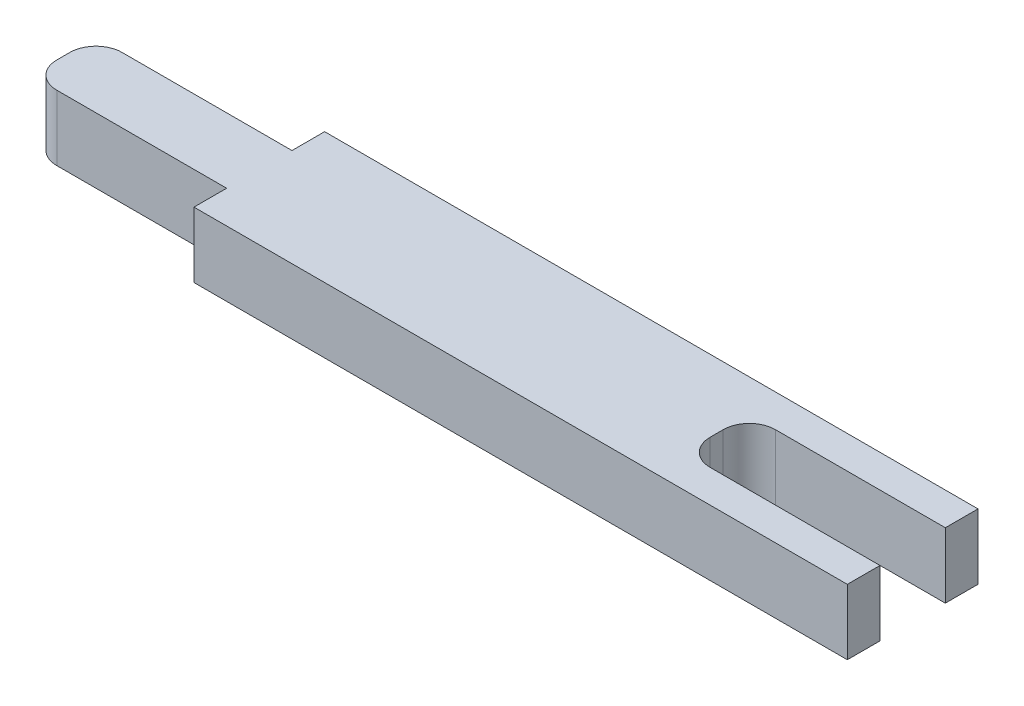
ISO-10303-21;
HEADER;
FILE_DESCRIPTION(('STEP AP214'),'2;1');
FILE_NAME('part.step','',(''),(''),'','','');
FILE_SCHEMA(('AUTOMOTIVE_DESIGN { 1 0 10303 214 1 1 1 1 }'));
ENDSEC;
DATA;
#1=APPLICATION_CONTEXT('core data for automotive mechanical design processes');
#2=APPLICATION_PROTOCOL_DEFINITION('international standard','automotive_design',2000,#1);
#3=PRODUCT_CONTEXT('',#1,'mechanical');
#4=PRODUCT('Part','Part','',(#3));
#5=PRODUCT_RELATED_PRODUCT_CATEGORY('part','',(#4));
#6=PRODUCT_DEFINITION_FORMATION('','',#4);
#7=PRODUCT_DEFINITION_CONTEXT('part definition',#1,'design');
#8=PRODUCT_DEFINITION('design','',#6,#7);
#9=PRODUCT_DEFINITION_SHAPE('','',#8);
#10=(LENGTH_UNIT() NAMED_UNIT(*) SI_UNIT(.MILLI.,.METRE.));
#11=(NAMED_UNIT(*) PLANE_ANGLE_UNIT() SI_UNIT($,.RADIAN.));
#12=(NAMED_UNIT(*) SI_UNIT($,.STERADIAN.) SOLID_ANGLE_UNIT());
#13=UNCERTAINTY_MEASURE_WITH_UNIT(LENGTH_MEASURE(1.E-05),#10,'distance_accuracy_value','');
#14=(GEOMETRIC_REPRESENTATION_CONTEXT(3) GLOBAL_UNCERTAINTY_ASSIGNED_CONTEXT((#13)) GLOBAL_UNIT_ASSIGNED_CONTEXT((#10,
#11,#12)) REPRESENTATION_CONTEXT('',''));
#15=CARTESIAN_POINT('',(0.,0.,0.));
#16=DIRECTION('',(0.,0.,1.));
#17=DIRECTION('',(1.,0.,0.));
#18=AXIS2_PLACEMENT_3D('',#15,#16,#17);
#19=CARTESIAN_POINT('',(0.,2.5,0.));
#20=DIRECTION('',(1.,0.,0.));
#21=DIRECTION('',(0.,0.,-1.));
#22=AXIS2_PLACEMENT_3D('',#19,#20,#21);
#23=PLANE('',#22);
#24=DIRECTION('',(0.,1.,0.));
#25=VECTOR('',#24,1.);
#26=CARTESIAN_POINT('',(0.,-2.5,-2.5));
#27=LINE('',#26,#25);
#28=CARTESIAN_POINT('',(0.,-2.5,-2.5));
#29=VERTEX_POINT('',#28);
#30=CARTESIAN_POINT('',(0.,2.5,-2.5));
#31=VERTEX_POINT('',#30);
#32=EDGE_CURVE('E243',#29,#31,#27,.T.);
#33=ORIENTED_EDGE('',*,*,#32,.F.);
#34=DIRECTION('',(0.,0.,1.));
#35=VECTOR('',#34,1.);
#36=CARTESIAN_POINT('',(0.,-2.5,0.));
#37=LINE('',#36,#35);
#38=CARTESIAN_POINT('',(0.,-2.5,0.));
#39=VERTEX_POINT('',#38);
#40=EDGE_CURVE('E187',#29,#39,#37,.T.);
#41=ORIENTED_EDGE('',*,*,#40,.T.);
#42=DIRECTION('',(0.,-1.,0.));
#43=VECTOR('',#42,1.);
#44=CARTESIAN_POINT('',(0.,2.5,0.));
#45=LINE('',#44,#43);
#46=CARTESIAN_POINT('',(0.,2.5,0.));
#47=VERTEX_POINT('',#46);
#48=EDGE_CURVE('E11',#47,#39,#45,.T.);
#49=ORIENTED_EDGE('',*,*,#48,.F.);
#50=DIRECTION('',(0.,0.,1.));
#51=VECTOR('',#50,1.);
#52=CARTESIAN_POINT('',(0.,2.5,0.));
#53=LINE('',#52,#51);
#54=EDGE_CURVE('E204',#31,#47,#53,.T.);
#55=ORIENTED_EDGE('',*,*,#54,.F.);
#56=EDGE_LOOP('',(#33,#41,#49,#55));
#57=FACE_BOUND('',#56,.T.);
#58=ADVANCED_FACE('F44',(#57),#23,.F.);
#59=CARTESIAN_POINT('',(50.,2.5,0.));
#60=DIRECTION('',(-1.,0.,0.));
#61=DIRECTION('',(0.,0.,1.));
#62=AXIS2_PLACEMENT_3D('',#59,#60,#61);
#63=PLANE('',#62);
#64=DIRECTION('',(0.,1.,0.));
#65=VECTOR('',#64,1.);
#66=CARTESIAN_POINT('',(50.,-2.5,-7.5));
#67=LINE('',#66,#65);
#68=CARTESIAN_POINT('',(50.,-2.5,-7.5));
#69=VERTEX_POINT('',#68);
#70=CARTESIAN_POINT('',(50.,2.5,-7.5));
#71=VERTEX_POINT('',#70);
#72=EDGE_CURVE('E228',#69,#71,#67,.T.);
#73=ORIENTED_EDGE('',*,*,#72,.F.);
#74=DIRECTION('',(0.,0.,-1.));
#75=VECTOR('',#74,1.);
#76=CARTESIAN_POINT('',(50.,-2.5,0.));
#77=LINE('',#76,#75);
#78=CARTESIAN_POINT('',(50.,-2.5,-10.));
#79=VERTEX_POINT('',#78);
#80=EDGE_CURVE('E188',#69,#79,#77,.T.);
#81=ORIENTED_EDGE('',*,*,#80,.T.);
#82=DIRECTION('',(0.,-1.,0.));
#83=VECTOR('',#82,1.);
#84=CARTESIAN_POINT('',(50.,2.5,-10.));
#85=LINE('',#84,#83);
#86=CARTESIAN_POINT('',(50.,2.5,-10.));
#87=VERTEX_POINT('',#86);
#88=EDGE_CURVE('E210',#87,#79,#85,.T.);
#89=ORIENTED_EDGE('',*,*,#88,.F.);
#90=DIRECTION('',(0.,0.,-1.));
#91=VECTOR('',#90,1.);
#92=CARTESIAN_POINT('',(50.,2.5,0.));
#93=LINE('',#92,#91);
#94=EDGE_CURVE('E276',#71,#87,#93,.T.);
#95=ORIENTED_EDGE('',*,*,#94,.F.);
#96=EDGE_LOOP('',(#73,#81,#89,#95));
#97=FACE_BOUND('',#96,.T.);
#98=ADVANCED_FACE('F291',(#97),#63,.F.);
#99=CARTESIAN_POINT('',(0.,2.5,0.));
#100=DIRECTION('',(0.,-1.,0.));
#101=DIRECTION('',(0.,0.,-1.));
#102=AXIS2_PLACEMENT_3D('',#99,#100,#101);
#103=PLANE('',#102);
#104=DIRECTION('',(-1.,0.,0.));
#105=VECTOR('',#104,1.);
#106=CARTESIAN_POINT('',(50.,2.5,-7.5));
#107=LINE('',#106,#105);
#108=CARTESIAN_POINT('',(37.,2.5,-7.5));
#109=VERTEX_POINT('',#108);
#110=EDGE_CURVE('E238',#71,#109,#107,.T.);
#111=ORIENTED_EDGE('',*,*,#110,.F.);
#112=ORIENTED_EDGE('',*,*,#94,.T.);
#113=DIRECTION('',(-1.,0.,0.));
#114=VECTOR('',#113,1.);
#115=CARTESIAN_POINT('',(0.,2.5,-10.));
#116=LINE('',#115,#114);
#117=CARTESIAN_POINT('',(0.,2.5,-10.));
#118=VERTEX_POINT('',#117);
#119=EDGE_CURVE('E191',#87,#118,#116,.T.);
#120=ORIENTED_EDGE('',*,*,#119,.T.);
#121=CARTESIAN_POINT('',(0.,2.5,-7.5));
#122=VERTEX_POINT('',#121);
#123=EDGE_CURVE('E273',#118,#122,#53,.T.);
#124=ORIENTED_EDGE('',*,*,#123,.T.);
#125=DIRECTION('',(-1.,0.,0.));
#126=VECTOR('',#125,1.);
#127=CARTESIAN_POINT('',(0.,2.5,-7.5));
#128=LINE('',#127,#126);
#129=CARTESIAN_POINT('',(-13.,2.5,-7.5));
#130=VERTEX_POINT('',#129);
#131=EDGE_CURVE('E62',#122,#130,#128,.T.);
#132=ORIENTED_EDGE('',*,*,#131,.T.);
#133=CARTESIAN_POINT('',(-13.,2.5,-5.5));
#134=DIRECTION('',(0.,1.,0.));
#135=DIRECTION('',(0.,0.,1.));
#136=AXIS2_PLACEMENT_3D('',#133,#134,#135);
#137=CIRCLE('',#136,2.);
#138=CARTESIAN_POINT('',(-15.,2.5,-5.49999999999998));
#139=VERTEX_POINT('',#138);
#140=EDGE_CURVE('E298',#130,#139,#137,.T.);
#141=ORIENTED_EDGE('',*,*,#140,.T.);
#142=DIRECTION('',(0.,0.,1.));
#143=VECTOR('',#142,1.);
#144=CARTESIAN_POINT('',(-15.,2.5,-4.50000000000001));
#145=LINE('',#144,#143);
#146=CARTESIAN_POINT('',(-15.,2.5,-4.50000000000001));
#147=VERTEX_POINT('',#146);
#148=EDGE_CURVE('E301',#139,#147,#145,.T.);
#149=ORIENTED_EDGE('',*,*,#148,.T.);
#150=CARTESIAN_POINT('',(-13.,2.5,-4.5));
#151=DIRECTION('',(0.,1.,0.));
#152=DIRECTION('',(0.,0.,-1.));
#153=AXIS2_PLACEMENT_3D('',#150,#151,#152);
#154=CIRCLE('',#153,2.);
#155=CARTESIAN_POINT('',(-13.,2.5,-2.5));
#156=VERTEX_POINT('',#155);
#157=EDGE_CURVE('E313',#147,#156,#154,.T.);
#158=ORIENTED_EDGE('',*,*,#157,.T.);
#159=DIRECTION('',(1.,0.,0.));
#160=VECTOR('',#159,1.);
#161=CARTESIAN_POINT('',(0.,2.5,-2.5));
#162=LINE('',#161,#160);
#163=EDGE_CURVE('E176',#156,#31,#162,.T.);
#164=ORIENTED_EDGE('',*,*,#163,.T.);
#165=ORIENTED_EDGE('',*,*,#54,.T.);
#166=DIRECTION('',(1.,0.,0.));
#167=VECTOR('',#166,1.);
#168=CARTESIAN_POINT('',(0.,2.5,0.));
#169=LINE('',#168,#167);
#170=CARTESIAN_POINT('',(50.,2.5,0.));
#171=VERTEX_POINT('',#170);
#172=EDGE_CURVE('E280',#47,#171,#169,.T.);
#173=ORIENTED_EDGE('',*,*,#172,.T.);
#174=CARTESIAN_POINT('',(50.,2.5,-2.5));
#175=VERTEX_POINT('',#174);
#176=EDGE_CURVE('E218',#171,#175,#93,.T.);
#177=ORIENTED_EDGE('',*,*,#176,.T.);
#178=DIRECTION('',(1.,0.,0.));
#179=VECTOR('',#178,1.);
#180=CARTESIAN_POINT('',(50.,2.5,-2.5));
#181=LINE('',#180,#179);
#182=CARTESIAN_POINT('',(37.,2.5,-2.5));
#183=VERTEX_POINT('',#182);
#184=EDGE_CURVE('E260',#183,#175,#181,.T.);
#185=ORIENTED_EDGE('',*,*,#184,.F.);
#186=CARTESIAN_POINT('',(37.,2.5,-4.5));
#187=DIRECTION('',(0.,1.,0.));
#188=DIRECTION('',(0.,0.,-1.));
#189=AXIS2_PLACEMENT_3D('',#186,#187,#188);
#190=CIRCLE('',#189,2.);
#191=CARTESIAN_POINT('',(35.,2.5,-4.50000000000002));
#192=VERTEX_POINT('',#191);
#193=EDGE_CURVE('E251',#192,#183,#190,.T.);
#194=ORIENTED_EDGE('',*,*,#193,.F.);
#195=DIRECTION('',(0.,0.,1.));
#196=VECTOR('',#195,1.);
#197=CARTESIAN_POINT('',(35.,2.5,-5.49999999999998));
#198=LINE('',#197,#196);
#199=CARTESIAN_POINT('',(35.,2.5,-5.49999999999998));
#200=VERTEX_POINT('',#199);
#201=EDGE_CURVE('E246',#200,#192,#198,.T.);
#202=ORIENTED_EDGE('',*,*,#201,.F.);
#203=CARTESIAN_POINT('',(37.,2.5,-5.5));
#204=DIRECTION('',(0.,1.,0.));
#205=DIRECTION('',(0.,0.,1.));
#206=AXIS2_PLACEMENT_3D('',#203,#204,#205);
#207=CIRCLE('',#206,2.);
#208=EDGE_CURVE('E241',#109,#200,#207,.T.);
#209=ORIENTED_EDGE('',*,*,#208,.F.);
#210=EDGE_LOOP('',(#111,#112,#120,#124,#132,#141,#149,#158,#164,#165,#173,#177,#185,#194,#202,#209));
#211=FACE_BOUND('',#210,.T.);
#212=ADVANCED_FACE('F289',(#211),#103,.F.);
#213=CARTESIAN_POINT('',(0.,-2.5,0.));
#214=DIRECTION('',(0.,-1.,0.));
#215=DIRECTION('',(0.,0.,-1.));
#216=AXIS2_PLACEMENT_3D('',#213,#214,#215);
#217=PLANE('',#216);
#218=CARTESIAN_POINT('',(37.,-2.5,-4.5));
#219=DIRECTION('',(0.,1.,0.));
#220=DIRECTION('',(0.,0.,-1.));
#221=AXIS2_PLACEMENT_3D('',#218,#219,#220);
#222=CIRCLE('',#221,2.);
#223=CARTESIAN_POINT('',(35.,-2.5,-4.50000000000002));
#224=VERTEX_POINT('',#223);
#225=CARTESIAN_POINT('',(37.,-2.5,-2.5));
#226=VERTEX_POINT('',#225);
#227=EDGE_CURVE('E66',#224,#226,#222,.T.);
#228=ORIENTED_EDGE('',*,*,#227,.T.);
#229=DIRECTION('',(1.,0.,0.));
#230=VECTOR('',#229,1.);
#231=CARTESIAN_POINT('',(50.,-2.5,-2.5));
#232=LINE('',#231,#230);
#233=CARTESIAN_POINT('',(50.,-2.5,-2.5));
#234=VERTEX_POINT('',#233);
#235=EDGE_CURVE('E227',#226,#234,#232,.T.);
#236=ORIENTED_EDGE('',*,*,#235,.T.);
#237=CARTESIAN_POINT('',(50.,-2.5,0.));
#238=VERTEX_POINT('',#237);
#239=EDGE_CURVE('E197',#238,#234,#77,.T.);
#240=ORIENTED_EDGE('',*,*,#239,.F.);
#241=DIRECTION('',(1.,0.,0.));
#242=VECTOR('',#241,1.);
#243=CARTESIAN_POINT('',(0.,-2.5,0.));
#244=LINE('',#243,#242);
#245=EDGE_CURVE('E183',#39,#238,#244,.T.);
#246=ORIENTED_EDGE('',*,*,#245,.F.);
#247=ORIENTED_EDGE('',*,*,#40,.F.);
#248=DIRECTION('',(1.,0.,0.));
#249=VECTOR('',#248,1.);
#250=CARTESIAN_POINT('',(0.,-2.5,-2.5));
#251=LINE('',#250,#249);
#252=CARTESIAN_POINT('',(-13.,-2.5,-2.5));
#253=VERTEX_POINT('',#252);
#254=EDGE_CURVE('E170',#253,#29,#251,.T.);
#255=ORIENTED_EDGE('',*,*,#254,.F.);
#256=CARTESIAN_POINT('',(-13.,-2.5,-4.5));
#257=DIRECTION('',(0.,1.,0.));
#258=DIRECTION('',(0.,0.,-1.));
#259=AXIS2_PLACEMENT_3D('',#256,#257,#258);
#260=CIRCLE('',#259,2.);
#261=CARTESIAN_POINT('',(-15.,-2.5,-4.50000000000001));
#262=VERTEX_POINT('',#261);
#263=EDGE_CURVE('E472',#262,#253,#260,.T.);
#264=ORIENTED_EDGE('',*,*,#263,.F.);
#265=DIRECTION('',(0.,0.,1.));
#266=VECTOR('',#265,1.);
#267=CARTESIAN_POINT('',(-15.,-2.5,-4.50000000000001));
#268=LINE('',#267,#266);
#269=CARTESIAN_POINT('',(-15.,-2.5,-5.49999999999998));
#270=VERTEX_POINT('',#269);
#271=EDGE_CURVE('E480',#270,#262,#268,.T.);
#272=ORIENTED_EDGE('',*,*,#271,.F.);
#273=CARTESIAN_POINT('',(-13.,-2.5,-5.5));
#274=DIRECTION('',(0.,1.,0.));
#275=DIRECTION('',(0.,0.,1.));
#276=AXIS2_PLACEMENT_3D('',#273,#274,#275);
#277=CIRCLE('',#276,2.);
#278=CARTESIAN_POINT('',(-13.,-2.5,-7.5));
#279=VERTEX_POINT('',#278);
#280=EDGE_CURVE('E180',#279,#270,#277,.T.);
#281=ORIENTED_EDGE('',*,*,#280,.F.);
#282=DIRECTION('',(-1.,0.,0.));
#283=VECTOR('',#282,1.);
#284=CARTESIAN_POINT('',(0.,-2.5,-7.5));
#285=LINE('',#284,#283);
#286=CARTESIAN_POINT('',(0.,-2.5,-7.5));
#287=VERTEX_POINT('',#286);
#288=EDGE_CURVE('E159',#287,#279,#285,.T.);
#289=ORIENTED_EDGE('',*,*,#288,.F.);
#290=CARTESIAN_POINT('',(0.,-2.5,-10.));
#291=VERTEX_POINT('',#290);
#292=EDGE_CURVE('E171',#291,#287,#37,.T.);
#293=ORIENTED_EDGE('',*,*,#292,.F.);
#294=DIRECTION('',(-1.,0.,0.));
#295=VECTOR('',#294,1.);
#296=CARTESIAN_POINT('',(0.,-2.5,-10.));
#297=LINE('',#296,#295);
#298=EDGE_CURVE('E203',#79,#291,#297,.T.);
#299=ORIENTED_EDGE('',*,*,#298,.F.);
#300=ORIENTED_EDGE('',*,*,#80,.F.);
#301=DIRECTION('',(-1.,0.,0.));
#302=VECTOR('',#301,1.);
#303=CARTESIAN_POINT('',(50.,-2.5,-7.5));
#304=LINE('',#303,#302);
#305=CARTESIAN_POINT('',(37.,-2.5,-7.5));
#306=VERTEX_POINT('',#305);
#307=EDGE_CURVE('E257',#69,#306,#304,.T.);
#308=ORIENTED_EDGE('',*,*,#307,.T.);
#309=CARTESIAN_POINT('',(37.,-2.5,-5.5));
#310=DIRECTION('',(0.,1.,0.));
#311=DIRECTION('',(0.,0.,1.));
#312=AXIS2_PLACEMENT_3D('',#309,#310,#311);
#313=CIRCLE('',#312,2.);
#314=CARTESIAN_POINT('',(35.,-2.5,-5.49999999999998));
#315=VERTEX_POINT('',#314);
#316=EDGE_CURVE('E331',#306,#315,#313,.T.);
#317=ORIENTED_EDGE('',*,*,#316,.T.);
#318=DIRECTION('',(0.,0.,1.));
#319=VECTOR('',#318,1.);
#320=CARTESIAN_POINT('',(35.,-2.5,-5.49999999999998));
#321=LINE('',#320,#319);
#322=EDGE_CURVE('E237',#315,#224,#321,.T.);
#323=ORIENTED_EDGE('',*,*,#322,.T.);
#324=EDGE_LOOP('',(#228,#236,#240,#246,#247,#255,#264,#272,#281,#289,#293,#299,#300,#308,#317,#323));
#325=FACE_BOUND('',#324,.T.);
#326=ADVANCED_FACE('F175',(#325),#217,.T.);
#327=ORIENTED_EDGE('',*,*,#292,.T.);
#328=DIRECTION('',(0.,1.,0.));
#329=VECTOR('',#328,1.);
#330=CARTESIAN_POINT('',(0.,-2.5,-7.5));
#331=LINE('',#330,#329);
#332=EDGE_CURVE('E160',#287,#122,#331,.T.);
#333=ORIENTED_EDGE('',*,*,#332,.T.);
#334=ORIENTED_EDGE('',*,*,#123,.F.);
#335=DIRECTION('',(0.,-1.,0.));
#336=VECTOR('',#335,1.);
#337=CARTESIAN_POINT('',(0.,2.5,-10.));
#338=LINE('',#337,#336);
#339=EDGE_CURVE('E181',#118,#291,#338,.T.);
#340=ORIENTED_EDGE('',*,*,#339,.T.);
#341=EDGE_LOOP('',(#327,#333,#334,#340));
#342=FACE_BOUND('',#341,.T.);
#343=ADVANCED_FACE('F50',(#342),#23,.F.);
#344=CARTESIAN_POINT('',(0.,2.5,0.));
#345=DIRECTION('',(0.,0.,-1.));
#346=DIRECTION('',(-1.,0.,0.));
#347=AXIS2_PLACEMENT_3D('',#344,#345,#346);
#348=PLANE('',#347);
#349=ORIENTED_EDGE('',*,*,#245,.T.);
#350=DIRECTION('',(0.,-1.,0.));
#351=VECTOR('',#350,1.);
#352=CARTESIAN_POINT('',(50.,2.5,0.));
#353=LINE('',#352,#351);
#354=EDGE_CURVE('E53',#171,#238,#353,.T.);
#355=ORIENTED_EDGE('',*,*,#354,.F.);
#356=ORIENTED_EDGE('',*,*,#172,.F.);
#357=ORIENTED_EDGE('',*,*,#48,.T.);
#358=EDGE_LOOP('',(#349,#355,#356,#357));
#359=FACE_BOUND('',#358,.T.);
#360=ADVANCED_FACE('F368',(#359),#348,.F.);
#361=ORIENTED_EDGE('',*,*,#239,.T.);
#362=DIRECTION('',(0.,1.,0.));
#363=VECTOR('',#362,1.);
#364=CARTESIAN_POINT('',(50.,-2.5,-2.5));
#365=LINE('',#364,#363);
#366=EDGE_CURVE('E195',#234,#175,#365,.T.);
#367=ORIENTED_EDGE('',*,*,#366,.T.);
#368=ORIENTED_EDGE('',*,*,#176,.F.);
#369=ORIENTED_EDGE('',*,*,#354,.T.);
#370=EDGE_LOOP('',(#361,#367,#368,#369));
#371=FACE_BOUND('',#370,.T.);
#372=ADVANCED_FACE('F216',(#371),#63,.F.);
#373=CARTESIAN_POINT('',(0.,2.5,-10.));
#374=DIRECTION('',(0.,0.,1.));
#375=DIRECTION('',(1.,0.,0.));
#376=AXIS2_PLACEMENT_3D('',#373,#374,#375);
#377=PLANE('',#376);
#378=ORIENTED_EDGE('',*,*,#298,.T.);
#379=ORIENTED_EDGE('',*,*,#339,.F.);
#380=ORIENTED_EDGE('',*,*,#119,.F.);
#381=ORIENTED_EDGE('',*,*,#88,.T.);
#382=EDGE_LOOP('',(#378,#379,#380,#381));
#383=FACE_BOUND('',#382,.T.);
#384=ADVANCED_FACE('F297',(#383),#377,.F.);
#385=CARTESIAN_POINT('',(50.,-2.5,-2.5));
#386=DIRECTION('',(0.,0.,1.));
#387=DIRECTION('',(1.,0.,0.));
#388=AXIS2_PLACEMENT_3D('',#385,#386,#387);
#389=PLANE('',#388);
#390=ORIENTED_EDGE('',*,*,#184,.T.);
#391=ORIENTED_EDGE('',*,*,#366,.F.);
#392=ORIENTED_EDGE('',*,*,#235,.F.);
#393=DIRECTION('',(0.,1.,0.));
#394=VECTOR('',#393,1.);
#395=CARTESIAN_POINT('',(37.,-2.5,-2.5));
#396=LINE('',#395,#394);
#397=EDGE_CURVE('E263',#226,#183,#396,.T.);
#398=ORIENTED_EDGE('',*,*,#397,.T.);
#399=EDGE_LOOP('',(#390,#391,#392,#398));
#400=FACE_BOUND('',#399,.T.);
#401=ADVANCED_FACE('F343',(#400),#389,.F.);
#402=CARTESIAN_POINT('',(37.,-2.5,-4.5));
#403=DIRECTION('',(0.,1.,0.));
#404=DIRECTION('',(0.,0.,1.));
#405=AXIS2_PLACEMENT_3D('',#402,#403,#404);
#406=CYLINDRICAL_SURFACE('',#405,2.);
#407=ORIENTED_EDGE('',*,*,#193,.T.);
#408=ORIENTED_EDGE('',*,*,#397,.F.);
#409=ORIENTED_EDGE('',*,*,#227,.F.);
#410=DIRECTION('',(0.,1.,0.));
#411=VECTOR('',#410,1.);
#412=CARTESIAN_POINT('',(35.,-2.5,-4.50000000000002));
#413=LINE('',#412,#411);
#414=EDGE_CURVE('E266',#224,#192,#413,.T.);
#415=ORIENTED_EDGE('',*,*,#414,.T.);
#416=EDGE_LOOP('',(#407,#408,#409,#415));
#417=FACE_BOUND('',#416,.T.);
#418=ADVANCED_FACE('F341',(#417),#406,.F.);
#419=CARTESIAN_POINT('',(35.,-2.5,-5.49999999999998));
#420=DIRECTION('',(-1.,0.,0.));
#421=DIRECTION('',(0.,0.,1.));
#422=AXIS2_PLACEMENT_3D('',#419,#420,#421);
#423=PLANE('',#422);
#424=ORIENTED_EDGE('',*,*,#201,.T.);
#425=ORIENTED_EDGE('',*,*,#414,.F.);
#426=ORIENTED_EDGE('',*,*,#322,.F.);
#427=DIRECTION('',(0.,1.,0.));
#428=VECTOR('',#427,1.);
#429=CARTESIAN_POINT('',(35.,-2.5,-5.49999999999998));
#430=LINE('',#429,#428);
#431=EDGE_CURVE('E267',#315,#200,#430,.T.);
#432=ORIENTED_EDGE('',*,*,#431,.T.);
#433=EDGE_LOOP('',(#424,#425,#426,#432));
#434=FACE_BOUND('',#433,.T.);
#435=ADVANCED_FACE('F342',(#434),#423,.F.);
#436=CARTESIAN_POINT('',(37.,-2.5,-5.5));
#437=DIRECTION('',(0.,1.,0.));
#438=DIRECTION('',(0.,0.,1.));
#439=AXIS2_PLACEMENT_3D('',#436,#437,#438);
#440=CYLINDRICAL_SURFACE('',#439,2.);
#441=ORIENTED_EDGE('',*,*,#208,.T.);
#442=ORIENTED_EDGE('',*,*,#431,.F.);
#443=ORIENTED_EDGE('',*,*,#316,.F.);
#444=DIRECTION('',(0.,1.,0.));
#445=VECTOR('',#444,1.);
#446=CARTESIAN_POINT('',(37.,-2.5,-7.5));
#447=LINE('',#446,#445);
#448=EDGE_CURVE('E231',#306,#109,#447,.T.);
#449=ORIENTED_EDGE('',*,*,#448,.T.);
#450=EDGE_LOOP('',(#441,#442,#443,#449));
#451=FACE_BOUND('',#450,.T.);
#452=ADVANCED_FACE('F433',(#451),#440,.F.);
#453=CARTESIAN_POINT('',(50.,-2.5,-7.5));
#454=DIRECTION('',(0.,0.,-1.));
#455=DIRECTION('',(-1.,0.,0.));
#456=AXIS2_PLACEMENT_3D('',#453,#454,#455);
#457=PLANE('',#456);
#458=ORIENTED_EDGE('',*,*,#110,.T.);
#459=ORIENTED_EDGE('',*,*,#448,.F.);
#460=ORIENTED_EDGE('',*,*,#307,.F.);
#461=ORIENTED_EDGE('',*,*,#72,.T.);
#462=EDGE_LOOP('',(#458,#459,#460,#461));
#463=FACE_BOUND('',#462,.T.);
#464=ADVANCED_FACE('F428',(#463),#457,.F.);
#465=CARTESIAN_POINT('',(0.,-2.5,-2.5));
#466=DIRECTION('',(0.,0.,1.));
#467=DIRECTION('',(1.,0.,0.));
#468=AXIS2_PLACEMENT_3D('',#465,#466,#467);
#469=PLANE('',#468);
#470=ORIENTED_EDGE('',*,*,#163,.F.);
#471=DIRECTION('',(0.,1.,0.));
#472=VECTOR('',#471,1.);
#473=CARTESIAN_POINT('',(-13.,-2.5,-2.5));
#474=LINE('',#473,#472);
#475=EDGE_CURVE('E319',#253,#156,#474,.T.);
#476=ORIENTED_EDGE('',*,*,#475,.F.);
#477=ORIENTED_EDGE('',*,*,#254,.T.);
#478=ORIENTED_EDGE('',*,*,#32,.T.);
#479=EDGE_LOOP('',(#470,#476,#477,#478));
#480=FACE_BOUND('',#479,.T.);
#481=ADVANCED_FACE('F435',(#480),#469,.T.);
#482=CARTESIAN_POINT('',(-13.,-2.5,-4.5));
#483=DIRECTION('',(0.,1.,0.));
#484=DIRECTION('',(0.,0.,1.));
#485=AXIS2_PLACEMENT_3D('',#482,#483,#484);
#486=CYLINDRICAL_SURFACE('',#485,2.);
#487=ORIENTED_EDGE('',*,*,#157,.F.);
#488=DIRECTION('',(0.,1.,0.));
#489=VECTOR('',#488,1.);
#490=CARTESIAN_POINT('',(-15.,-2.5,-4.50000000000001));
#491=LINE('',#490,#489);
#492=EDGE_CURVE('E323',#262,#147,#491,.T.);
#493=ORIENTED_EDGE('',*,*,#492,.F.);
#494=ORIENTED_EDGE('',*,*,#263,.T.);
#495=ORIENTED_EDGE('',*,*,#475,.T.);
#496=EDGE_LOOP('',(#487,#493,#494,#495));
#497=FACE_BOUND('',#496,.T.);
#498=ADVANCED_FACE('F487',(#497),#486,.T.);
#499=CARTESIAN_POINT('',(-15.,-2.5,-4.50000000000001));
#500=DIRECTION('',(-1.,0.,0.));
#501=DIRECTION('',(0.,0.,1.));
#502=AXIS2_PLACEMENT_3D('',#499,#500,#501);
#503=PLANE('',#502);
#504=ORIENTED_EDGE('',*,*,#148,.F.);
#505=DIRECTION('',(0.,1.,0.));
#506=VECTOR('',#505,1.);
#507=CARTESIAN_POINT('',(-15.,-2.5,-5.49999999999998));
#508=LINE('',#507,#506);
#509=EDGE_CURVE('E326',#270,#139,#508,.T.);
#510=ORIENTED_EDGE('',*,*,#509,.F.);
#511=ORIENTED_EDGE('',*,*,#271,.T.);
#512=ORIENTED_EDGE('',*,*,#492,.T.);
#513=EDGE_LOOP('',(#504,#510,#511,#512));
#514=FACE_BOUND('',#513,.T.);
#515=ADVANCED_FACE('F490',(#514),#503,.T.);
#516=CARTESIAN_POINT('',(-13.,-2.5,-5.5));
#517=DIRECTION('',(0.,1.,0.));
#518=DIRECTION('',(0.,0.,1.));
#519=AXIS2_PLACEMENT_3D('',#516,#517,#518);
#520=CYLINDRICAL_SURFACE('',#519,2.);
#521=ORIENTED_EDGE('',*,*,#140,.F.);
#522=DIRECTION('',(0.,1.,0.));
#523=VECTOR('',#522,1.);
#524=CARTESIAN_POINT('',(-13.,-2.5,-7.5));
#525=LINE('',#524,#523);
#526=EDGE_CURVE('E167',#279,#130,#525,.T.);
#527=ORIENTED_EDGE('',*,*,#526,.F.);
#528=ORIENTED_EDGE('',*,*,#280,.T.);
#529=ORIENTED_EDGE('',*,*,#509,.T.);
#530=EDGE_LOOP('',(#521,#527,#528,#529));
#531=FACE_BOUND('',#530,.T.);
#532=ADVANCED_FACE('F482',(#531),#520,.T.);
#533=CARTESIAN_POINT('',(0.,-2.5,-7.5));
#534=DIRECTION('',(0.,0.,-1.));
#535=DIRECTION('',(-1.,0.,0.));
#536=AXIS2_PLACEMENT_3D('',#533,#534,#535);
#537=PLANE('',#536);
#538=ORIENTED_EDGE('',*,*,#131,.F.);
#539=ORIENTED_EDGE('',*,*,#332,.F.);
#540=ORIENTED_EDGE('',*,*,#288,.T.);
#541=ORIENTED_EDGE('',*,*,#526,.T.);
#542=EDGE_LOOP('',(#538,#539,#540,#541));
#543=FACE_BOUND('',#542,.T.);
#544=ADVANCED_FACE('F157',(#543),#537,.T.);
#545=CLOSED_SHELL('',(#58,#98,#212,#326,#343,#360,#372,#384,#401,#418,#435,#452,#464,#481,#498,
#515,#532,#544));
#546=MANIFOLD_SOLID_BREP('B2',#545);
#547=ADVANCED_BREP_SHAPE_REPRESENTATION('',(#18,#546),#14);
#548=SHAPE_DEFINITION_REPRESENTATION(#9,#547);
ENDSEC;
END-ISO-10303-21;
